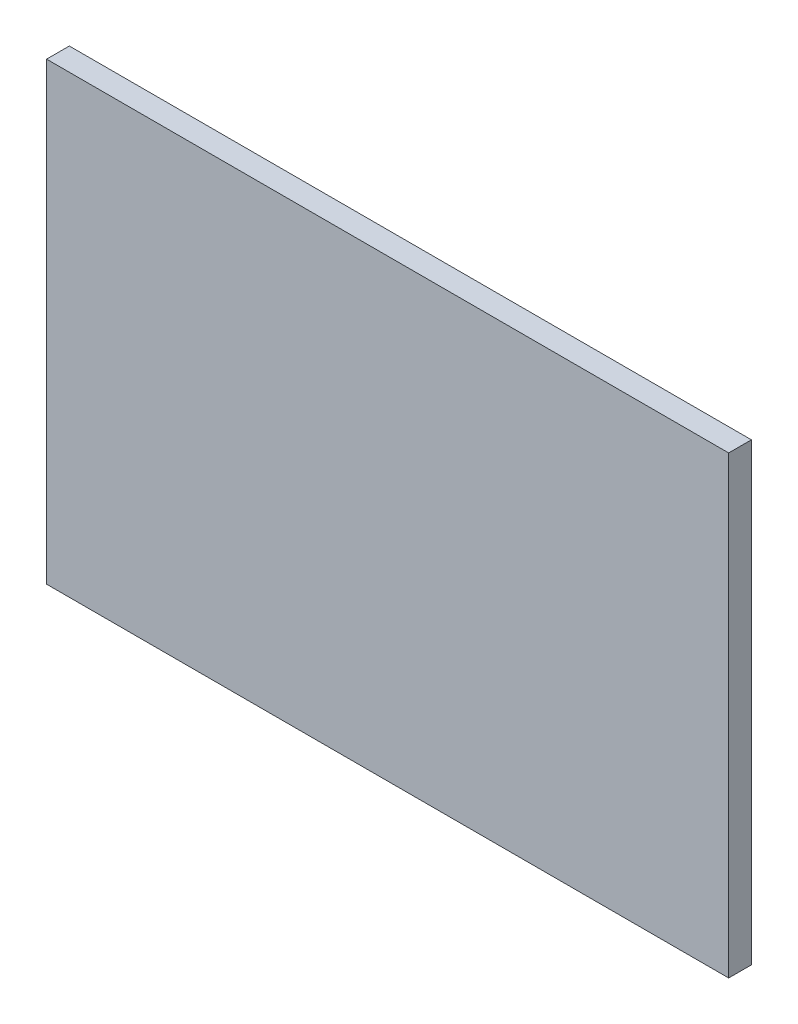
ISO-10303-21;
HEADER;
FILE_DESCRIPTION(('STEP AP214'),'2;1');
FILE_NAME('part.step','',(''),(''),'','','');
FILE_SCHEMA(('AUTOMOTIVE_DESIGN { 1 0 10303 214 1 1 1 1 }'));
ENDSEC;
DATA;
#1=APPLICATION_CONTEXT('core data for automotive mechanical design processes');
#2=APPLICATION_PROTOCOL_DEFINITION('international standard','automotive_design',2000,#1);
#3=PRODUCT_CONTEXT('',#1,'mechanical');
#4=PRODUCT('Part','Part','',(#3));
#5=PRODUCT_RELATED_PRODUCT_CATEGORY('part','',(#4));
#6=PRODUCT_DEFINITION_FORMATION('','',#4);
#7=PRODUCT_DEFINITION_CONTEXT('part definition',#1,'design');
#8=PRODUCT_DEFINITION('design','',#6,#7);
#9=PRODUCT_DEFINITION_SHAPE('','',#8);
#10=(LENGTH_UNIT() NAMED_UNIT(*) SI_UNIT(.MILLI.,.METRE.));
#11=(NAMED_UNIT(*) PLANE_ANGLE_UNIT() SI_UNIT($,.RADIAN.));
#12=(NAMED_UNIT(*) SI_UNIT($,.STERADIAN.) SOLID_ANGLE_UNIT());
#13=UNCERTAINTY_MEASURE_WITH_UNIT(LENGTH_MEASURE(1.E-05),#10,'distance_accuracy_value','');
#14=(GEOMETRIC_REPRESENTATION_CONTEXT(3) GLOBAL_UNCERTAINTY_ASSIGNED_CONTEXT((#13)) GLOBAL_UNIT_ASSIGNED_CONTEXT((#10,
#11,#12)) REPRESENTATION_CONTEXT('',''));
#15=CARTESIAN_POINT('',(0.,0.,0.));
#16=DIRECTION('',(0.,0.,1.));
#17=DIRECTION('',(1.,0.,0.));
#18=AXIS2_PLACEMENT_3D('',#15,#16,#17);
#19=CARTESIAN_POINT('',(30.,-20.,2.));
#20=DIRECTION('',(-1.,0.,0.));
#21=DIRECTION('',(0.,0.,1.));
#22=AXIS2_PLACEMENT_3D('',#19,#20,#21);
#23=PLANE('',#22);
#24=DIRECTION('',(0.,1.,0.));
#25=VECTOR('',#24,1.);
#26=CARTESIAN_POINT('',(30.,-20.,0.));
#27=LINE('',#26,#25);
#28=CARTESIAN_POINT('',(30.,-20.,0.));
#29=VERTEX_POINT('',#28);
#30=CARTESIAN_POINT('',(30.,20.,0.));
#31=VERTEX_POINT('',#30);
#32=EDGE_CURVE('E102',#29,#31,#27,.T.);
#33=ORIENTED_EDGE('',*,*,#32,.T.);
#34=DIRECTION('',(0.,0.,-1.));
#35=VECTOR('',#34,1.);
#36=CARTESIAN_POINT('',(30.,20.,2.));
#37=LINE('',#36,#35);
#38=CARTESIAN_POINT('',(30.,20.,2.));
#39=VERTEX_POINT('',#38);
#40=EDGE_CURVE('E11',#39,#31,#37,.T.);
#41=ORIENTED_EDGE('',*,*,#40,.F.);
#42=DIRECTION('',(0.,1.,0.));
#43=VECTOR('',#42,1.);
#44=CARTESIAN_POINT('',(30.,-20.,2.));
#45=LINE('',#44,#43);
#46=CARTESIAN_POINT('',(30.,-20.,2.));
#47=VERTEX_POINT('',#46);
#48=EDGE_CURVE('E90',#47,#39,#45,.T.);
#49=ORIENTED_EDGE('',*,*,#48,.F.);
#50=DIRECTION('',(0.,0.,-1.));
#51=VECTOR('',#50,1.);
#52=CARTESIAN_POINT('',(30.,-20.,2.));
#53=LINE('',#52,#51);
#54=EDGE_CURVE('E98',#47,#29,#53,.T.);
#55=ORIENTED_EDGE('',*,*,#54,.T.);
#56=EDGE_LOOP('',(#33,#41,#49,#55));
#57=FACE_BOUND('',#56,.T.);
#58=ADVANCED_FACE('F39',(#57),#23,.F.);
#59=CARTESIAN_POINT('',(-30.,20.,2.));
#60=DIRECTION('',(0.,-1.,0.));
#61=DIRECTION('',(0.,0.,-1.));
#62=AXIS2_PLACEMENT_3D('',#59,#60,#61);
#63=PLANE('',#62);
#64=DIRECTION('',(-1.,0.,0.));
#65=VECTOR('',#64,1.);
#66=CARTESIAN_POINT('',(-30.,20.,0.));
#67=LINE('',#66,#65);
#68=CARTESIAN_POINT('',(-30.,20.,0.));
#69=VERTEX_POINT('',#68);
#70=EDGE_CURVE('E94',#31,#69,#67,.T.);
#71=ORIENTED_EDGE('',*,*,#70,.T.);
#72=DIRECTION('',(0.,0.,-1.));
#73=VECTOR('',#72,1.);
#74=CARTESIAN_POINT('',(-30.,20.,2.));
#75=LINE('',#74,#73);
#76=CARTESIAN_POINT('',(-30.,20.,2.));
#77=VERTEX_POINT('',#76);
#78=EDGE_CURVE('E47',#77,#69,#75,.T.);
#79=ORIENTED_EDGE('',*,*,#78,.F.);
#80=DIRECTION('',(-1.,0.,0.));
#81=VECTOR('',#80,1.);
#82=CARTESIAN_POINT('',(-30.,20.,2.));
#83=LINE('',#82,#81);
#84=EDGE_CURVE('E85',#39,#77,#83,.T.);
#85=ORIENTED_EDGE('',*,*,#84,.F.);
#86=ORIENTED_EDGE('',*,*,#40,.T.);
#87=EDGE_LOOP('',(#71,#79,#85,#86));
#88=FACE_BOUND('',#87,.T.);
#89=ADVANCED_FACE('F93',(#88),#63,.F.);
#90=CARTESIAN_POINT('',(-30.,-20.,2.));
#91=DIRECTION('',(1.,0.,0.));
#92=DIRECTION('',(0.,0.,-1.));
#93=AXIS2_PLACEMENT_3D('',#90,#91,#92);
#94=PLANE('',#93);
#95=DIRECTION('',(0.,-1.,0.));
#96=VECTOR('',#95,1.);
#97=CARTESIAN_POINT('',(-30.,-20.,0.));
#98=LINE('',#97,#96);
#99=CARTESIAN_POINT('',(-30.,-20.,0.));
#100=VERTEX_POINT('',#99);
#101=EDGE_CURVE('E72',#69,#100,#98,.T.);
#102=ORIENTED_EDGE('',*,*,#101,.T.);
#103=DIRECTION('',(0.,0.,-1.));
#104=VECTOR('',#103,1.);
#105=CARTESIAN_POINT('',(-30.,-20.,2.));
#106=LINE('',#105,#104);
#107=CARTESIAN_POINT('',(-30.,-20.,2.));
#108=VERTEX_POINT('',#107);
#109=EDGE_CURVE('E95',#108,#100,#106,.T.);
#110=ORIENTED_EDGE('',*,*,#109,.F.);
#111=DIRECTION('',(0.,-1.,0.));
#112=VECTOR('',#111,1.);
#113=CARTESIAN_POINT('',(-30.,-20.,2.));
#114=LINE('',#113,#112);
#115=EDGE_CURVE('E88',#77,#108,#114,.T.);
#116=ORIENTED_EDGE('',*,*,#115,.F.);
#117=ORIENTED_EDGE('',*,*,#78,.T.);
#118=EDGE_LOOP('',(#102,#110,#116,#117));
#119=FACE_BOUND('',#118,.T.);
#120=ADVANCED_FACE('F96',(#119),#94,.F.);
#121=CARTESIAN_POINT('',(-30.,-20.,2.));
#122=DIRECTION('',(0.,1.,0.));
#123=DIRECTION('',(0.,0.,1.));
#124=AXIS2_PLACEMENT_3D('',#121,#122,#123);
#125=PLANE('',#124);
#126=DIRECTION('',(1.,0.,0.));
#127=VECTOR('',#126,1.);
#128=CARTESIAN_POINT('',(-30.,-20.,0.));
#129=LINE('',#128,#127);
#130=EDGE_CURVE('E78',#100,#29,#129,.T.);
#131=ORIENTED_EDGE('',*,*,#130,.T.);
#132=ORIENTED_EDGE('',*,*,#54,.F.);
#133=DIRECTION('',(1.,0.,0.));
#134=VECTOR('',#133,1.);
#135=CARTESIAN_POINT('',(-30.,-20.,2.));
#136=LINE('',#135,#134);
#137=EDGE_CURVE('E55',#108,#47,#136,.T.);
#138=ORIENTED_EDGE('',*,*,#137,.F.);
#139=ORIENTED_EDGE('',*,*,#109,.T.);
#140=EDGE_LOOP('',(#131,#132,#138,#139));
#141=FACE_BOUND('',#140,.T.);
#142=ADVANCED_FACE('F109',(#141),#125,.F.);
#143=CARTESIAN_POINT('',(0.,0.,2.));
#144=DIRECTION('',(0.,0.,-1.));
#145=DIRECTION('',(-1.,0.,0.));
#146=AXIS2_PLACEMENT_3D('',#143,#144,#145);
#147=PLANE('',#146);
#148=ORIENTED_EDGE('',*,*,#48,.T.);
#149=ORIENTED_EDGE('',*,*,#84,.T.);
#150=ORIENTED_EDGE('',*,*,#115,.T.);
#151=ORIENTED_EDGE('',*,*,#137,.T.);
#152=EDGE_LOOP('',(#148,#149,#150,#151));
#153=FACE_BOUND('',#152,.T.);
#154=ADVANCED_FACE('F86',(#153),#147,.F.);
#155=CARTESIAN_POINT('',(0.,0.,0.));
#156=DIRECTION('',(0.,0.,-1.));
#157=DIRECTION('',(-1.,0.,0.));
#158=AXIS2_PLACEMENT_3D('',#155,#156,#157);
#159=PLANE('',#158);
#160=ORIENTED_EDGE('',*,*,#32,.F.);
#161=ORIENTED_EDGE('',*,*,#130,.F.);
#162=ORIENTED_EDGE('',*,*,#101,.F.);
#163=ORIENTED_EDGE('',*,*,#70,.F.);
#164=EDGE_LOOP('',(#160,#161,#162,#163));
#165=FACE_BOUND('',#164,.T.);
#166=ADVANCED_FACE('F112',(#165),#159,.T.);
#167=CLOSED_SHELL('',(#58,#89,#120,#142,#154,#166));
#168=MANIFOLD_SOLID_BREP('B2',#167);
#169=ADVANCED_BREP_SHAPE_REPRESENTATION('',(#18,#168),#14);
#170=SHAPE_DEFINITION_REPRESENTATION(#9,#169);
ENDSEC;
END-ISO-10303-21;
